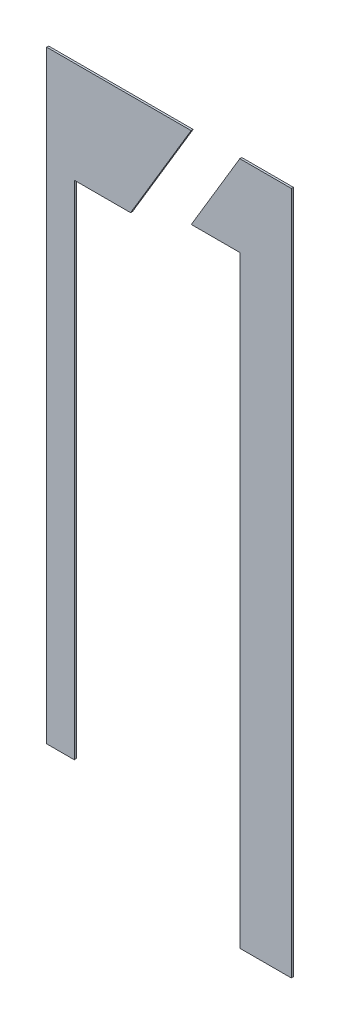
ISO-10303-21;
HEADER;
FILE_DESCRIPTION(('STEP AP214'),'2;1');
FILE_NAME('part.step','',(''),(''),'','','');
FILE_SCHEMA(('AUTOMOTIVE_DESIGN { 1 0 10303 214 1 1 1 1 }'));
ENDSEC;
DATA;
#1=APPLICATION_CONTEXT('core data for automotive mechanical design processes');
#2=APPLICATION_PROTOCOL_DEFINITION('international standard','automotive_design',2000,#1);
#3=PRODUCT_CONTEXT('',#1,'mechanical');
#4=PRODUCT('Part','Part','',(#3));
#5=PRODUCT_RELATED_PRODUCT_CATEGORY('part','',(#4));
#6=PRODUCT_DEFINITION_FORMATION('','',#4);
#7=PRODUCT_DEFINITION_CONTEXT('part definition',#1,'design');
#8=PRODUCT_DEFINITION('design','',#6,#7);
#9=PRODUCT_DEFINITION_SHAPE('','',#8);
#10=(LENGTH_UNIT() NAMED_UNIT(*) SI_UNIT(.MILLI.,.METRE.));
#11=(NAMED_UNIT(*) PLANE_ANGLE_UNIT() SI_UNIT($,.RADIAN.));
#12=(NAMED_UNIT(*) SI_UNIT($,.STERADIAN.) SOLID_ANGLE_UNIT());
#13=UNCERTAINTY_MEASURE_WITH_UNIT(LENGTH_MEASURE(1.E-05),#10,'distance_accuracy_value','');
#14=(GEOMETRIC_REPRESENTATION_CONTEXT(3) GLOBAL_UNCERTAINTY_ASSIGNED_CONTEXT((#13)) GLOBAL_UNIT_ASSIGNED_CONTEXT((#10,
#11,#12)) REPRESENTATION_CONTEXT('',''));
#15=CARTESIAN_POINT('',(0.,0.,0.));
#16=DIRECTION('',(0.,0.,1.));
#17=DIRECTION('',(1.,0.,0.));
#18=AXIS2_PLACEMENT_3D('',#15,#16,#17);
#19=CARTESIAN_POINT('',(-16.9569497288801,23.6557051627938,0.5));
#20=DIRECTION('',(0.,1.,0.));
#21=DIRECTION('',(0.,0.,1.));
#22=AXIS2_PLACEMENT_3D('',#19,#20,#21);
#23=PLANE('',#22);
#24=DIRECTION('',(1.,0.,0.));
#25=VECTOR('',#24,1.);
#26=CARTESIAN_POINT('',(-16.9569497288801,23.6557051627938,0.));
#27=LINE('',#26,#25);
#28=CARTESIAN_POINT('',(-16.9569497288801,23.6557051627938,0.));
#29=VERTEX_POINT('',#28);
#30=CARTESIAN_POINT('',(-2.95694972888009,23.6557051627938,0.));
#31=VERTEX_POINT('',#30);
#32=EDGE_CURVE('E133',#29,#31,#27,.T.);
#33=ORIENTED_EDGE('',*,*,#32,.T.);
#34=DIRECTION('',(0.,0.,-1.));
#35=VECTOR('',#34,1.);
#36=CARTESIAN_POINT('',(-2.95694972888009,23.6557051627938,0.5));
#37=LINE('',#36,#35);
#38=CARTESIAN_POINT('',(-2.95694972888009,23.6557051627938,0.5));
#39=VERTEX_POINT('',#38);
#40=EDGE_CURVE('E12',#39,#31,#37,.T.);
#41=ORIENTED_EDGE('',*,*,#40,.F.);
#42=DIRECTION('',(1.,0.,0.));
#43=VECTOR('',#42,1.);
#44=CARTESIAN_POINT('',(-16.9569497288801,23.6557051627938,0.5));
#45=LINE('',#44,#43);
#46=CARTESIAN_POINT('',(-16.9569497288801,23.6557051627938,0.5));
#47=VERTEX_POINT('',#46);
#48=EDGE_CURVE('E143',#47,#39,#45,.T.);
#49=ORIENTED_EDGE('',*,*,#48,.F.);
#50=DIRECTION('',(0.,0.,-1.));
#51=VECTOR('',#50,1.);
#52=CARTESIAN_POINT('',(-16.9569497288801,23.6557051627938,0.5));
#53=LINE('',#52,#51);
#54=EDGE_CURVE('E129',#47,#29,#53,.T.);
#55=ORIENTED_EDGE('',*,*,#54,.T.);
#56=EDGE_LOOP('',(#33,#41,#49,#55));
#57=FACE_BOUND('',#56,.T.);
#58=ADVANCED_FACE('F49',(#57),#23,.F.);
#59=CARTESIAN_POINT('',(-2.95694972888009,23.6557051627938,0.5));
#60=DIRECTION('',(-0.858515680273204,0.512787311392392,0.));
#61=DIRECTION('',(-0.512787311392391,-0.858515680273204,0.));
#62=AXIS2_PLACEMENT_3D('',#59,#60,#61);
#63=PLANE('',#62);
#64=DIRECTION('',(0.512787311392391,0.858515680273204,0.));
#65=VECTOR('',#64,1.);
#66=CARTESIAN_POINT('',(-2.95694972888009,23.6557051627938,0.));
#67=LINE('',#66,#65);
#68=CARTESIAN_POINT('',(12.1005432288663,48.8651702229319,0.));
#69=VERTEX_POINT('',#68);
#70=EDGE_CURVE('E136',#31,#69,#67,.T.);
#71=ORIENTED_EDGE('',*,*,#70,.T.);
#72=DIRECTION('',(0.,0.,-1.));
#73=VECTOR('',#72,1.);
#74=CARTESIAN_POINT('',(12.1005432288663,48.8651702229319,0.5));
#75=LINE('',#74,#73);
#76=CARTESIAN_POINT('',(12.1005432288663,48.8651702229319,0.5));
#77=VERTEX_POINT('',#76);
#78=EDGE_CURVE('E57',#77,#69,#75,.T.);
#79=ORIENTED_EDGE('',*,*,#78,.F.);
#80=DIRECTION('',(0.512787311392391,0.858515680273204,0.));
#81=VECTOR('',#80,1.);
#82=CARTESIAN_POINT('',(-2.95694972888009,23.6557051627938,0.5));
#83=LINE('',#82,#81);
#84=EDGE_CURVE('E102',#39,#77,#83,.T.);
#85=ORIENTED_EDGE('',*,*,#84,.F.);
#86=ORIENTED_EDGE('',*,*,#40,.T.);
#87=EDGE_LOOP('',(#71,#79,#85,#86));
#88=FACE_BOUND('',#87,.T.);
#89=ADVANCED_FACE('F167',(#88),#63,.F.);
#90=CARTESIAN_POINT('',(12.1005432288663,48.8651702229319,0.5));
#91=DIRECTION('',(0.,-1.,0.));
#92=DIRECTION('',(0.,0.,-1.));
#93=AXIS2_PLACEMENT_3D('',#90,#91,#92);
#94=PLANE('',#93);
#95=DIRECTION('',(-1.,0.,0.));
#96=VECTOR('',#95,1.);
#97=CARTESIAN_POINT('',(12.1005432288663,48.8651702229319,0.));
#98=LINE('',#97,#96);
#99=CARTESIAN_POINT('',(-23.8149497288801,48.8651702229319,0.));
#100=VERTEX_POINT('',#99);
#101=EDGE_CURVE('E138',#69,#100,#98,.T.);
#102=ORIENTED_EDGE('',*,*,#101,.T.);
#103=DIRECTION('',(0.,0.,-1.));
#104=VECTOR('',#103,1.);
#105=CARTESIAN_POINT('',(-23.8149497288801,48.8651702229319,0.5));
#106=LINE('',#105,#104);
#107=CARTESIAN_POINT('',(-23.8149497288801,48.8651702229319,0.5));
#108=VERTEX_POINT('',#107);
#109=EDGE_CURVE('E124',#108,#100,#106,.T.);
#110=ORIENTED_EDGE('',*,*,#109,.F.);
#111=DIRECTION('',(-1.,0.,0.));
#112=VECTOR('',#111,1.);
#113=CARTESIAN_POINT('',(12.1005432288663,48.8651702229319,0.5));
#114=LINE('',#113,#112);
#115=EDGE_CURVE('E115',#77,#108,#114,.T.);
#116=ORIENTED_EDGE('',*,*,#115,.F.);
#117=ORIENTED_EDGE('',*,*,#78,.T.);
#118=EDGE_LOOP('',(#102,#110,#116,#117));
#119=FACE_BOUND('',#118,.T.);
#120=ADVANCED_FACE('F149',(#119),#94,.F.);
#121=CARTESIAN_POINT('',(-23.8149497288801,48.8651702229319,0.5));
#122=DIRECTION('',(1.,0.,0.));
#123=DIRECTION('',(0.,1.,0.));
#124=AXIS2_PLACEMENT_3D('',#121,#122,#123);
#125=PLANE('',#124);
#126=DIRECTION('',(0.,-1.,0.));
#127=VECTOR('',#126,1.);
#128=CARTESIAN_POINT('',(-23.8149497288801,48.8651702229319,0.));
#129=LINE('',#128,#127);
#130=CARTESIAN_POINT('',(-23.8149497288801,-101.134829777068,0.));
#131=VERTEX_POINT('',#130);
#132=EDGE_CURVE('E123',#100,#131,#129,.T.);
#133=ORIENTED_EDGE('',*,*,#132,.T.);
#134=DIRECTION('',(0.,0.,-1.));
#135=VECTOR('',#134,1.);
#136=CARTESIAN_POINT('',(-23.8149497288801,-101.134829777068,0.5));
#137=LINE('',#136,#135);
#138=CARTESIAN_POINT('',(-23.8149497288801,-101.134829777068,0.5));
#139=VERTEX_POINT('',#138);
#140=EDGE_CURVE('E120',#139,#131,#137,.T.);
#141=ORIENTED_EDGE('',*,*,#140,.F.);
#142=DIRECTION('',(0.,-1.,0.));
#143=VECTOR('',#142,1.);
#144=CARTESIAN_POINT('',(-23.8149497288801,48.8651702229319,0.5));
#145=LINE('',#144,#143);
#146=EDGE_CURVE('E109',#108,#139,#145,.T.);
#147=ORIENTED_EDGE('',*,*,#146,.F.);
#148=ORIENTED_EDGE('',*,*,#109,.T.);
#149=EDGE_LOOP('',(#133,#141,#147,#148));
#150=FACE_BOUND('',#149,.T.);
#151=ADVANCED_FACE('F121',(#150),#125,.F.);
#152=CARTESIAN_POINT('',(-23.8149497288801,-101.134829777068,0.5));
#153=DIRECTION('',(0.,1.,0.));
#154=DIRECTION('',(0.,0.,1.));
#155=AXIS2_PLACEMENT_3D('',#152,#153,#154);
#156=PLANE('',#155);
#157=DIRECTION('',(1.,0.,0.));
#158=VECTOR('',#157,1.);
#159=CARTESIAN_POINT('',(-23.8149497288801,-101.134829777068,0.));
#160=LINE('',#159,#158);
#161=CARTESIAN_POINT('',(-16.9569497288801,-101.134829777068,0.));
#162=VERTEX_POINT('',#161);
#163=EDGE_CURVE('E88',#131,#162,#160,.T.);
#164=ORIENTED_EDGE('',*,*,#163,.T.);
#165=DIRECTION('',(0.,0.,-1.));
#166=VECTOR('',#165,1.);
#167=CARTESIAN_POINT('',(-16.9569497288801,-101.134829777068,0.5));
#168=LINE('',#167,#166);
#169=CARTESIAN_POINT('',(-16.9569497288801,-101.134829777068,0.5));
#170=VERTEX_POINT('',#169);
#171=EDGE_CURVE('E125',#170,#162,#168,.T.);
#172=ORIENTED_EDGE('',*,*,#171,.F.);
#173=DIRECTION('',(1.,0.,0.));
#174=VECTOR('',#173,1.);
#175=CARTESIAN_POINT('',(-23.8149497288801,-101.134829777068,0.5));
#176=LINE('',#175,#174);
#177=EDGE_CURVE('E113',#139,#170,#176,.T.);
#178=ORIENTED_EDGE('',*,*,#177,.F.);
#179=ORIENTED_EDGE('',*,*,#140,.T.);
#180=EDGE_LOOP('',(#164,#172,#178,#179));
#181=FACE_BOUND('',#180,.T.);
#182=ADVANCED_FACE('F127',(#181),#156,.F.);
#183=CARTESIAN_POINT('',(-16.9569497288801,-101.134829777068,0.5));
#184=DIRECTION('',(-1.,0.,0.));
#185=DIRECTION('',(0.,-1.,0.));
#186=AXIS2_PLACEMENT_3D('',#183,#184,#185);
#187=PLANE('',#186);
#188=DIRECTION('',(0.,1.,0.));
#189=VECTOR('',#188,1.);
#190=CARTESIAN_POINT('',(-16.9569497288801,-101.134829777068,0.));
#191=LINE('',#190,#189);
#192=EDGE_CURVE('E94',#162,#29,#191,.T.);
#193=ORIENTED_EDGE('',*,*,#192,.T.);
#194=ORIENTED_EDGE('',*,*,#54,.F.);
#195=DIRECTION('',(0.,1.,0.));
#196=VECTOR('',#195,1.);
#197=CARTESIAN_POINT('',(-16.9569497288801,-101.134829777068,0.5));
#198=LINE('',#197,#196);
#199=EDGE_CURVE('E65',#170,#47,#198,.T.);
#200=ORIENTED_EDGE('',*,*,#199,.F.);
#201=ORIENTED_EDGE('',*,*,#171,.T.);
#202=EDGE_LOOP('',(#193,#194,#200,#201));
#203=FACE_BOUND('',#202,.T.);
#204=ADVANCED_FACE('F156',(#203),#187,.F.);
#205=CARTESIAN_POINT('',(0.,0.,0.5));
#206=DIRECTION('',(0.,0.,-1.));
#207=DIRECTION('',(-1.,0.,0.));
#208=AXIS2_PLACEMENT_3D('',#205,#206,#207);
#209=PLANE('',#208);
#210=ORIENTED_EDGE('',*,*,#48,.T.);
#211=ORIENTED_EDGE('',*,*,#84,.T.);
#212=ORIENTED_EDGE('',*,*,#115,.T.);
#213=ORIENTED_EDGE('',*,*,#146,.T.);
#214=ORIENTED_EDGE('',*,*,#177,.T.);
#215=ORIENTED_EDGE('',*,*,#199,.T.);
#216=EDGE_LOOP('',(#210,#211,#212,#213,#214,#215));
#217=FACE_BOUND('',#216,.T.);
#218=ADVANCED_FACE('F111',(#217),#209,.F.);
#219=CARTESIAN_POINT('',(0.,0.,0.));
#220=DIRECTION('',(0.,0.,-1.));
#221=DIRECTION('',(-1.,0.,0.));
#222=AXIS2_PLACEMENT_3D('',#219,#220,#221);
#223=PLANE('',#222);
#224=ORIENTED_EDGE('',*,*,#32,.F.);
#225=ORIENTED_EDGE('',*,*,#192,.F.);
#226=ORIENTED_EDGE('',*,*,#163,.F.);
#227=ORIENTED_EDGE('',*,*,#132,.F.);
#228=ORIENTED_EDGE('',*,*,#101,.F.);
#229=ORIENTED_EDGE('',*,*,#70,.F.);
#230=EDGE_LOOP('',(#224,#225,#226,#227,#228,#229));
#231=FACE_BOUND('',#230,.T.);
#232=ADVANCED_FACE('F152',(#231),#223,.T.);
#233=CLOSED_SHELL('',(#58,#89,#120,#151,#182,#204,#218,#232));
#234=MANIFOLD_SOLID_BREP('B2',#233);
#235=CARTESIAN_POINT('',(24.1989248424027,28.6655837907678,0.5));
#236=DIRECTION('',(0.,1.,0.));
#237=DIRECTION('',(-1.,0.,0.));
#238=AXIS2_PLACEMENT_3D('',#235,#236,#237);
#239=PLANE('',#238);
#240=DIRECTION('',(1.,0.,0.));
#241=VECTOR('',#240,1.);
#242=CARTESIAN_POINT('',(24.1989248424027,28.6655837907678,0.));
#243=LINE('',#242,#241);
#244=CARTESIAN_POINT('',(12.1338084376663,28.6655837907678,0.));
#245=VERTEX_POINT('',#244);
#246=CARTESIAN_POINT('',(24.1989248424027,28.6655837907678,0.));
#247=VERTEX_POINT('',#246);
#248=EDGE_CURVE('E314',#245,#247,#243,.T.);
#249=ORIENTED_EDGE('',*,*,#248,.T.);
#250=DIRECTION('',(0.,0.,-1.));
#251=VECTOR('',#250,1.);
#252=CARTESIAN_POINT('',(24.1989248424027,28.6655837907678,0.5));
#253=LINE('',#252,#251);
#254=CARTESIAN_POINT('',(24.1989248424027,28.6655837907678,0.5));
#255=VERTEX_POINT('',#254);
#256=EDGE_CURVE('E47',#255,#247,#253,.T.);
#257=ORIENTED_EDGE('',*,*,#256,.F.);
#258=DIRECTION('',(1.,0.,0.));
#259=VECTOR('',#258,1.);
#260=CARTESIAN_POINT('',(24.1989248424027,28.6655837907678,0.5));
#261=LINE('',#260,#259);
#262=CARTESIAN_POINT('',(12.1338084376663,28.6655837907678,0.5));
#263=VERTEX_POINT('',#262);
#264=EDGE_CURVE('E330',#263,#255,#261,.T.);
#265=ORIENTED_EDGE('',*,*,#264,.F.);
#266=DIRECTION('',(0.,0.,-1.));
#267=VECTOR('',#266,1.);
#268=CARTESIAN_POINT('',(12.1338084376663,28.6655837907678,0.5));
#269=LINE('',#268,#267);
#270=EDGE_CURVE('E310',#263,#245,#269,.T.);
#271=ORIENTED_EDGE('',*,*,#270,.T.);
#272=EDGE_LOOP('',(#249,#257,#265,#271));
#273=FACE_BOUND('',#272,.T.);
#274=ADVANCED_FACE('F225',(#273),#239,.F.);
#275=CARTESIAN_POINT('',(24.1989248424027,-121.134829777068,0.5));
#276=DIRECTION('',(1.,0.,0.));
#277=DIRECTION('',(0.,0.,-1.));
#278=AXIS2_PLACEMENT_3D('',#275,#276,#277);
#279=PLANE('',#278);
#280=DIRECTION('',(0.,-1.,0.));
#281=VECTOR('',#280,1.);
#282=CARTESIAN_POINT('',(24.1989248424027,-121.134829777068,0.));
#283=LINE('',#282,#281);
#284=CARTESIAN_POINT('',(24.1989248424027,-121.134829777068,0.));
#285=VERTEX_POINT('',#284);
#286=EDGE_CURVE('E318',#247,#285,#283,.T.);
#287=ORIENTED_EDGE('',*,*,#286,.T.);
#288=DIRECTION('',(0.,0.,-1.));
#289=VECTOR('',#288,1.);
#290=CARTESIAN_POINT('',(24.1989248424027,-121.134829777068,0.5));
#291=LINE('',#290,#289);
#292=CARTESIAN_POINT('',(24.1989248424027,-121.134829777068,0.5));
#293=VERTEX_POINT('',#292);
#294=EDGE_CURVE('E234',#293,#285,#291,.T.);
#295=ORIENTED_EDGE('',*,*,#294,.F.);
#296=DIRECTION('',(0.,-1.,0.));
#297=VECTOR('',#296,1.);
#298=CARTESIAN_POINT('',(24.1989248424027,-121.134829777068,0.5));
#299=LINE('',#298,#297);
#300=EDGE_CURVE('E279',#255,#293,#299,.T.);
#301=ORIENTED_EDGE('',*,*,#300,.F.);
#302=ORIENTED_EDGE('',*,*,#256,.T.);
#303=EDGE_LOOP('',(#287,#295,#301,#302));
#304=FACE_BOUND('',#303,.T.);
#305=ADVANCED_FACE('F358',(#304),#279,.F.);
#306=CARTESIAN_POINT('',(37.0019516795706,-121.134829777068,0.5));
#307=DIRECTION('',(0.,1.,0.));
#308=DIRECTION('',(0.,0.,1.));
#309=AXIS2_PLACEMENT_3D('',#306,#307,#308);
#310=PLANE('',#309);
#311=DIRECTION('',(1.,0.,0.));
#312=VECTOR('',#311,1.);
#313=CARTESIAN_POINT('',(37.0019516795706,-121.134829777068,0.));
#314=LINE('',#313,#312);
#315=CARTESIAN_POINT('',(37.0019516795706,-121.134829777068,0.));
#316=VERTEX_POINT('',#315);
#317=EDGE_CURVE('E321',#285,#316,#314,.T.);
#318=ORIENTED_EDGE('',*,*,#317,.T.);
#319=DIRECTION('',(0.,0.,-1.));
#320=VECTOR('',#319,1.);
#321=CARTESIAN_POINT('',(37.0019516795706,-121.134829777068,0.5));
#322=LINE('',#321,#320);
#323=CARTESIAN_POINT('',(37.0019516795706,-121.134829777068,0.5));
#324=VERTEX_POINT('',#323);
#325=EDGE_CURVE('E303',#324,#316,#322,.T.);
#326=ORIENTED_EDGE('',*,*,#325,.F.);
#327=DIRECTION('',(1.,0.,0.));
#328=VECTOR('',#327,1.);
#329=CARTESIAN_POINT('',(37.0019516795706,-121.134829777068,0.5));
#330=LINE('',#329,#328);
#331=EDGE_CURVE('E292',#293,#324,#330,.T.);
#332=ORIENTED_EDGE('',*,*,#331,.F.);
#333=ORIENTED_EDGE('',*,*,#294,.T.);
#334=EDGE_LOOP('',(#318,#326,#332,#333));
#335=FACE_BOUND('',#334,.T.);
#336=ADVANCED_FACE('F340',(#335),#310,.F.);
#337=CARTESIAN_POINT('',(37.0019516795706,48.8651702229319,0.5));
#338=DIRECTION('',(-1.,0.,0.));
#339=DIRECTION('',(0.,-1.,0.));
#340=AXIS2_PLACEMENT_3D('',#337,#338,#339);
#341=PLANE('',#340);
#342=DIRECTION('',(0.,1.,0.));
#343=VECTOR('',#342,1.);
#344=CARTESIAN_POINT('',(37.0019516795706,48.8651702229319,0.));
#345=LINE('',#344,#343);
#346=CARTESIAN_POINT('',(37.0019516795706,48.8651702229319,0.));
#347=VERTEX_POINT('',#346);
#348=EDGE_CURVE('E301',#316,#347,#345,.T.);
#349=ORIENTED_EDGE('',*,*,#348,.T.);
#350=DIRECTION('',(0.,0.,-1.));
#351=VECTOR('',#350,1.);
#352=CARTESIAN_POINT('',(37.0019516795706,48.8651702229319,0.5));
#353=LINE('',#352,#351);
#354=CARTESIAN_POINT('',(37.0019516795706,48.8651702229319,0.5));
#355=VERTEX_POINT('',#354);
#356=EDGE_CURVE('E298',#355,#347,#353,.T.);
#357=ORIENTED_EDGE('',*,*,#356,.F.);
#358=DIRECTION('',(0.,1.,0.));
#359=VECTOR('',#358,1.);
#360=CARTESIAN_POINT('',(37.0019516795706,48.8651702229319,0.5));
#361=LINE('',#360,#359);
#362=EDGE_CURVE('E286',#324,#355,#361,.T.);
#363=ORIENTED_EDGE('',*,*,#362,.F.);
#364=ORIENTED_EDGE('',*,*,#325,.T.);
#365=EDGE_LOOP('',(#349,#357,#363,#364));
#366=FACE_BOUND('',#365,.T.);
#367=ADVANCED_FACE('F299',(#366),#341,.F.);
#368=CARTESIAN_POINT('',(24.1989248424027,48.8651702229319,0.5));
#369=DIRECTION('',(0.,-1.,0.));
#370=DIRECTION('',(1.,0.,0.));
#371=AXIS2_PLACEMENT_3D('',#368,#369,#370);
#372=PLANE('',#371);
#373=DIRECTION('',(-1.,0.,0.));
#374=VECTOR('',#373,1.);
#375=CARTESIAN_POINT('',(24.1989248424027,48.8651702229319,0.));
#376=LINE('',#375,#374);
#377=CARTESIAN_POINT('',(24.1989248424027,48.8651702229319,0.));
#378=VERTEX_POINT('',#377);
#379=EDGE_CURVE('E265',#347,#378,#376,.T.);
#380=ORIENTED_EDGE('',*,*,#379,.T.);
#381=DIRECTION('',(0.,0.,-1.));
#382=VECTOR('',#381,1.);
#383=CARTESIAN_POINT('',(24.1989248424027,48.8651702229319,0.5));
#384=LINE('',#383,#382);
#385=CARTESIAN_POINT('',(24.1989248424027,48.8651702229319,0.5));
#386=VERTEX_POINT('',#385);
#387=EDGE_CURVE('E304',#386,#378,#384,.T.);
#388=ORIENTED_EDGE('',*,*,#387,.F.);
#389=DIRECTION('',(-1.,0.,0.));
#390=VECTOR('',#389,1.);
#391=CARTESIAN_POINT('',(24.1989248424027,48.8651702229319,0.5));
#392=LINE('',#391,#390);
#393=EDGE_CURVE('E290',#355,#386,#392,.T.);
#394=ORIENTED_EDGE('',*,*,#393,.F.);
#395=ORIENTED_EDGE('',*,*,#356,.T.);
#396=EDGE_LOOP('',(#380,#388,#394,#395));
#397=FACE_BOUND('',#396,.T.);
#398=ADVANCED_FACE('F306',(#397),#372,.F.);
#399=CARTESIAN_POINT('',(12.1338084376663,28.6655837907678,0.5));
#400=DIRECTION('',(0.858515680273204,-0.512787311392391,0.));
#401=DIRECTION('',(0.512787311392391,0.858515680273204,0.));
#402=AXIS2_PLACEMENT_3D('',#399,#400,#401);
#403=PLANE('',#402);
#404=DIRECTION('',(-0.512787311392391,-0.858515680273204,0.));
#405=VECTOR('',#404,1.);
#406=CARTESIAN_POINT('',(12.1338084376663,28.6655837907678,0.));
#407=LINE('',#406,#405);
#408=EDGE_CURVE('E271',#378,#245,#407,.T.);
#409=ORIENTED_EDGE('',*,*,#408,.T.);
#410=ORIENTED_EDGE('',*,*,#270,.F.);
#411=DIRECTION('',(-0.512787311392391,-0.858515680273204,0.));
#412=VECTOR('',#411,1.);
#413=CARTESIAN_POINT('',(12.1338084376663,28.6655837907678,0.5));
#414=LINE('',#413,#412);
#415=EDGE_CURVE('E242',#386,#263,#414,.T.);
#416=ORIENTED_EDGE('',*,*,#415,.F.);
#417=ORIENTED_EDGE('',*,*,#387,.T.);
#418=EDGE_LOOP('',(#409,#410,#416,#417));
#419=FACE_BOUND('',#418,.T.);
#420=ADVANCED_FACE('F347',(#419),#403,.F.);
#421=CARTESIAN_POINT('',(0.,0.,0.5));
#422=DIRECTION('',(0.,0.,1.));
#423=DIRECTION('',(1.,0.,0.));
#424=AXIS2_PLACEMENT_3D('',#421,#422,#423);
#425=PLANE('',#424);
#426=ORIENTED_EDGE('',*,*,#264,.T.);
#427=ORIENTED_EDGE('',*,*,#300,.T.);
#428=ORIENTED_EDGE('',*,*,#331,.T.);
#429=ORIENTED_EDGE('',*,*,#362,.T.);
#430=ORIENTED_EDGE('',*,*,#393,.T.);
#431=ORIENTED_EDGE('',*,*,#415,.T.);
#432=EDGE_LOOP('',(#426,#427,#428,#429,#430,#431));
#433=FACE_BOUND('',#432,.T.);
#434=ADVANCED_FACE('F288',(#433),#425,.T.);
#435=CARTESIAN_POINT('',(0.,0.,0.));
#436=DIRECTION('',(0.,0.,1.));
#437=DIRECTION('',(1.,0.,0.));
#438=AXIS2_PLACEMENT_3D('',#435,#436,#437);
#439=PLANE('',#438);
#440=ORIENTED_EDGE('',*,*,#248,.F.);
#441=ORIENTED_EDGE('',*,*,#408,.F.);
#442=ORIENTED_EDGE('',*,*,#379,.F.);
#443=ORIENTED_EDGE('',*,*,#348,.F.);
#444=ORIENTED_EDGE('',*,*,#317,.F.);
#445=ORIENTED_EDGE('',*,*,#286,.F.);
#446=EDGE_LOOP('',(#440,#441,#442,#443,#444,#445));
#447=FACE_BOUND('',#446,.T.);
#448=ADVANCED_FACE('F343',(#447),#439,.F.);
#449=CLOSED_SHELL('',(#274,#305,#336,#367,#398,#420,#434,#448));
#450=MANIFOLD_SOLID_BREP('B6',#449);
#451=ADVANCED_BREP_SHAPE_REPRESENTATION('',(#18,#234,#450),#14);
#452=SHAPE_DEFINITION_REPRESENTATION(#9,#451);
ENDSEC;
END-ISO-10303-21;
